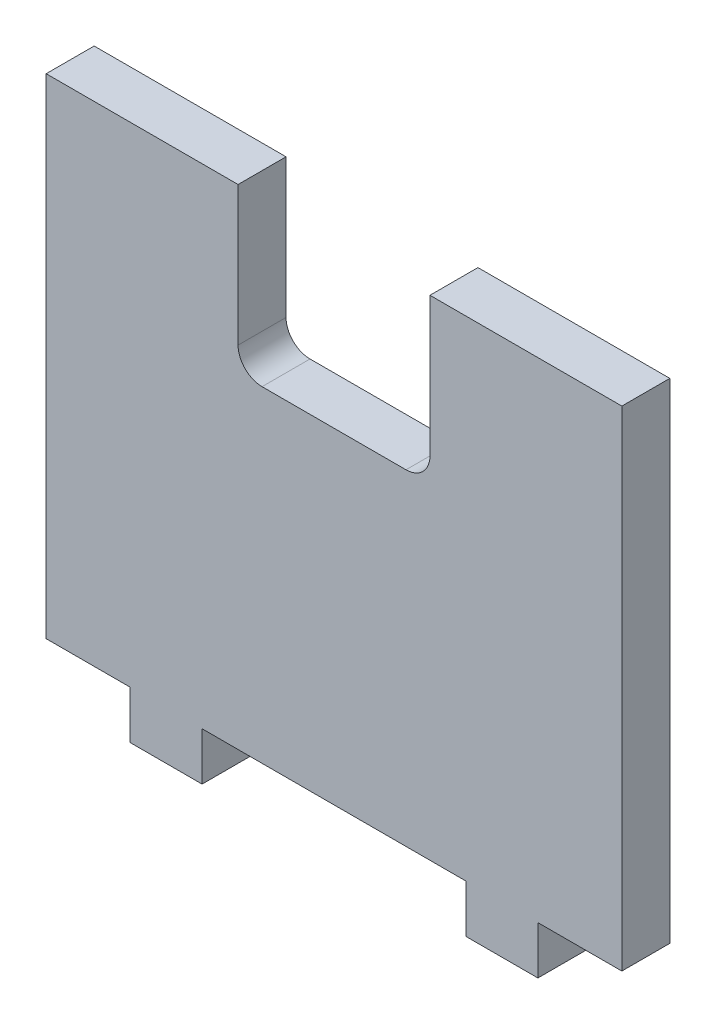
ISO-10303-21;
HEADER;
FILE_DESCRIPTION(('STEP AP214'),'2;1');
FILE_NAME('part.step','',(''),(''),'','','');
FILE_SCHEMA(('AUTOMOTIVE_DESIGN { 1 0 10303 214 1 1 1 1 }'));
ENDSEC;
DATA;
#1=APPLICATION_CONTEXT('core data for automotive mechanical design processes');
#2=APPLICATION_PROTOCOL_DEFINITION('international standard','automotive_design',2000,#1);
#3=PRODUCT_CONTEXT('',#1,'mechanical');
#4=PRODUCT('Part','Part','',(#3));
#5=PRODUCT_RELATED_PRODUCT_CATEGORY('part','',(#4));
#6=PRODUCT_DEFINITION_FORMATION('','',#4);
#7=PRODUCT_DEFINITION_CONTEXT('part definition',#1,'design');
#8=PRODUCT_DEFINITION('design','',#6,#7);
#9=PRODUCT_DEFINITION_SHAPE('','',#8);
#10=(LENGTH_UNIT() NAMED_UNIT(*) SI_UNIT(.MILLI.,.METRE.));
#11=(NAMED_UNIT(*) PLANE_ANGLE_UNIT() SI_UNIT($,.RADIAN.));
#12=(NAMED_UNIT(*) SI_UNIT($,.STERADIAN.) SOLID_ANGLE_UNIT());
#13=UNCERTAINTY_MEASURE_WITH_UNIT(LENGTH_MEASURE(1.E-05),#10,'distance_accuracy_value','');
#14=(GEOMETRIC_REPRESENTATION_CONTEXT(3) GLOBAL_UNCERTAINTY_ASSIGNED_CONTEXT((#13)) GLOBAL_UNIT_ASSIGNED_CONTEXT((#10,
#11,#12)) REPRESENTATION_CONTEXT('',''));
#15=CARTESIAN_POINT('',(0.,0.,0.));
#16=DIRECTION('',(0.,0.,1.));
#17=DIRECTION('',(1.,0.,0.));
#18=AXIS2_PLACEMENT_3D('',#15,#16,#17);
#19=CARTESIAN_POINT('',(-76.2000000000001,142.24,-12.7));
#20=DIRECTION('',(0.,1.,0.));
#21=DIRECTION('',(0.,0.,1.));
#22=AXIS2_PLACEMENT_3D('',#19,#20,#21);
#23=PLANE('',#22);
#24=DIRECTION('',(0.,0.,1.));
#25=VECTOR('',#24,1.);
#26=CARTESIAN_POINT('',(-25.3999999999998,142.24,-12.7));
#27=LINE('',#26,#25);
#28=CARTESIAN_POINT('',(-25.3999999999998,142.24,-12.7));
#29=VERTEX_POINT('',#28);
#30=CARTESIAN_POINT('',(-25.3999999999998,142.24,0.));
#31=VERTEX_POINT('',#30);
#32=EDGE_CURVE('E178',#29,#31,#27,.T.);
#33=ORIENTED_EDGE('',*,*,#32,.F.);
#34=DIRECTION('',(-1.,0.,0.));
#35=VECTOR('',#34,1.);
#36=CARTESIAN_POINT('',(-76.2000000000001,142.24,-12.7));
#37=LINE('',#36,#35);
#38=CARTESIAN_POINT('',(-76.2000000000001,142.24,-12.7));
#39=VERTEX_POINT('',#38);
#40=EDGE_CURVE('E184',#29,#39,#37,.T.);
#41=ORIENTED_EDGE('',*,*,#40,.T.);
#42=DIRECTION('',(0.,0.,1.));
#43=VECTOR('',#42,1.);
#44=CARTESIAN_POINT('',(-76.2000000000001,142.24,-12.7));
#45=LINE('',#44,#43);
#46=CARTESIAN_POINT('',(-76.2000000000001,142.24,0.));
#47=VERTEX_POINT('',#46);
#48=EDGE_CURVE('E229',#39,#47,#45,.T.);
#49=ORIENTED_EDGE('',*,*,#48,.T.);
#50=DIRECTION('',(-1.,0.,0.));
#51=VECTOR('',#50,1.);
#52=CARTESIAN_POINT('',(-76.2000000000001,142.24,0.));
#53=LINE('',#52,#51);
#54=EDGE_CURVE('E225',#31,#47,#53,.T.);
#55=ORIENTED_EDGE('',*,*,#54,.F.);
#56=EDGE_LOOP('',(#33,#41,#49,#55));
#57=FACE_BOUND('',#56,.T.);
#58=ADVANCED_FACE('F31',(#57),#23,.T.);
#59=CARTESIAN_POINT('',(-76.2000000000001,142.24,-12.7));
#60=DIRECTION('',(-1.,0.,0.));
#61=DIRECTION('',(0.,-1.,0.));
#62=AXIS2_PLACEMENT_3D('',#59,#60,#61);
#63=PLANE('',#62);
#64=DIRECTION('',(0.,-1.,0.));
#65=VECTOR('',#64,1.);
#66=CARTESIAN_POINT('',(-76.2000000000001,142.24,0.));
#67=LINE('',#66,#65);
#68=CARTESIAN_POINT('',(-76.2,12.7,0.));
#69=VERTEX_POINT('',#68);
#70=EDGE_CURVE('E192',#47,#69,#67,.T.);
#71=ORIENTED_EDGE('',*,*,#70,.F.);
#72=ORIENTED_EDGE('',*,*,#48,.F.);
#73=DIRECTION('',(0.,-1.,0.));
#74=VECTOR('',#73,1.);
#75=CARTESIAN_POINT('',(-76.2000000000001,142.24,-12.7));
#76=LINE('',#75,#74);
#77=CARTESIAN_POINT('',(-76.2,12.7,-12.7));
#78=VERTEX_POINT('',#77);
#79=EDGE_CURVE('E228',#39,#78,#76,.T.);
#80=ORIENTED_EDGE('',*,*,#79,.T.);
#81=DIRECTION('',(0.,0.,1.));
#82=VECTOR('',#81,1.);
#83=CARTESIAN_POINT('',(-76.2,12.7,-12.7));
#84=LINE('',#83,#82);
#85=EDGE_CURVE('E183',#78,#69,#84,.T.);
#86=ORIENTED_EDGE('',*,*,#85,.T.);
#87=EDGE_LOOP('',(#71,#72,#80,#86));
#88=FACE_BOUND('',#87,.T.);
#89=ADVANCED_FACE('F281',(#88),#63,.T.);
#90=DIRECTION('',(0.,0.,1.));
#91=VECTOR('',#90,1.);
#92=CARTESIAN_POINT('',(25.3999999999998,142.24,-12.7));
#93=LINE('',#92,#91);
#94=CARTESIAN_POINT('',(25.3999999999998,142.24,-12.7));
#95=VERTEX_POINT('',#94);
#96=CARTESIAN_POINT('',(25.3999999999998,142.24,0.));
#97=VERTEX_POINT('',#96);
#98=EDGE_CURVE('E168',#95,#97,#93,.T.);
#99=ORIENTED_EDGE('',*,*,#98,.T.);
#100=CARTESIAN_POINT('',(76.1999999999999,142.24,0.));
#101=VERTEX_POINT('',#100);
#102=EDGE_CURVE('E226',#101,#97,#53,.T.);
#103=ORIENTED_EDGE('',*,*,#102,.F.);
#104=DIRECTION('',(0.,0.,1.));
#105=VECTOR('',#104,1.);
#106=CARTESIAN_POINT('',(76.1999999999999,142.24,-12.7));
#107=LINE('',#106,#105);
#108=CARTESIAN_POINT('',(76.1999999999999,142.24,-12.7));
#109=VERTEX_POINT('',#108);
#110=EDGE_CURVE('E181',#109,#101,#107,.T.);
#111=ORIENTED_EDGE('',*,*,#110,.F.);
#112=EDGE_CURVE('E161',#109,#95,#37,.T.);
#113=ORIENTED_EDGE('',*,*,#112,.T.);
#114=EDGE_LOOP('',(#99,#103,#111,#113));
#115=FACE_BOUND('',#114,.T.);
#116=ADVANCED_FACE('F180',(#115),#23,.T.);
#117=CARTESIAN_POINT('',(76.1999999999999,142.24,-12.7));
#118=DIRECTION('',(1.,0.,0.));
#119=DIRECTION('',(0.,1.,0.));
#120=AXIS2_PLACEMENT_3D('',#117,#118,#119);
#121=PLANE('',#120);
#122=DIRECTION('',(0.,1.,0.));
#123=VECTOR('',#122,1.);
#124=CARTESIAN_POINT('',(76.1999999999999,142.24,0.));
#125=LINE('',#124,#123);
#126=CARTESIAN_POINT('',(76.2,12.7,0.));
#127=VERTEX_POINT('',#126);
#128=EDGE_CURVE('E222',#127,#101,#125,.T.);
#129=ORIENTED_EDGE('',*,*,#128,.F.);
#130=DIRECTION('',(0.,0.,1.));
#131=VECTOR('',#130,1.);
#132=CARTESIAN_POINT('',(76.2,12.7,-12.7));
#133=LINE('',#132,#131);
#134=CARTESIAN_POINT('',(76.2,12.7,-12.7));
#135=VERTEX_POINT('',#134);
#136=EDGE_CURVE('E234',#135,#127,#133,.T.);
#137=ORIENTED_EDGE('',*,*,#136,.F.);
#138=DIRECTION('',(0.,1.,0.));
#139=VECTOR('',#138,1.);
#140=CARTESIAN_POINT('',(76.1999999999999,142.24,-12.7));
#141=LINE('',#140,#139);
#142=EDGE_CURVE('E188',#135,#109,#141,.T.);
#143=ORIENTED_EDGE('',*,*,#142,.T.);
#144=ORIENTED_EDGE('',*,*,#110,.T.);
#145=EDGE_LOOP('',(#129,#137,#143,#144));
#146=FACE_BOUND('',#145,.T.);
#147=ADVANCED_FACE('F292',(#146),#121,.T.);
#148=CARTESIAN_POINT('',(53.975,12.7,-12.7));
#149=DIRECTION('',(0.,-1.,0.));
#150=DIRECTION('',(0.,0.,-1.));
#151=AXIS2_PLACEMENT_3D('',#148,#149,#150);
#152=PLANE('',#151);
#153=DIRECTION('',(1.,0.,0.));
#154=VECTOR('',#153,1.);
#155=CARTESIAN_POINT('',(53.975,12.7,0.));
#156=LINE('',#155,#154);
#157=CARTESIAN_POINT('',(53.975,12.7,0.));
#158=VERTEX_POINT('',#157);
#159=EDGE_CURVE('E219',#158,#127,#156,.T.);
#160=ORIENTED_EDGE('',*,*,#159,.F.);
#161=DIRECTION('',(0.,0.,1.));
#162=VECTOR('',#161,1.);
#163=CARTESIAN_POINT('',(53.975,12.7,-12.7));
#164=LINE('',#163,#162);
#165=CARTESIAN_POINT('',(53.975,12.7,-12.7));
#166=VERTEX_POINT('',#165);
#167=EDGE_CURVE('E236',#166,#158,#164,.T.);
#168=ORIENTED_EDGE('',*,*,#167,.F.);
#169=DIRECTION('',(1.,0.,0.));
#170=VECTOR('',#169,1.);
#171=CARTESIAN_POINT('',(53.975,12.7,-12.7));
#172=LINE('',#171,#170);
#173=EDGE_CURVE('E374',#166,#135,#172,.T.);
#174=ORIENTED_EDGE('',*,*,#173,.T.);
#175=ORIENTED_EDGE('',*,*,#136,.T.);
#176=EDGE_LOOP('',(#160,#168,#174,#175));
#177=FACE_BOUND('',#176,.T.);
#178=ADVANCED_FACE('F296',(#177),#152,.T.);
#179=CARTESIAN_POINT('',(53.975,0.,-12.7));
#180=DIRECTION('',(1.,0.,0.));
#181=DIRECTION('',(0.,0.,-1.));
#182=AXIS2_PLACEMENT_3D('',#179,#180,#181);
#183=PLANE('',#182);
#184=DIRECTION('',(0.,1.,0.));
#185=VECTOR('',#184,1.);
#186=CARTESIAN_POINT('',(53.975,0.,0.));
#187=LINE('',#186,#185);
#188=CARTESIAN_POINT('',(53.975,0.,0.));
#189=VERTEX_POINT('',#188);
#190=EDGE_CURVE('E216',#189,#158,#187,.T.);
#191=ORIENTED_EDGE('',*,*,#190,.F.);
#192=DIRECTION('',(0.,0.,1.));
#193=VECTOR('',#192,1.);
#194=CARTESIAN_POINT('',(53.975,0.,-12.7));
#195=LINE('',#194,#193);
#196=CARTESIAN_POINT('',(53.975,0.,-12.7));
#197=VERTEX_POINT('',#196);
#198=EDGE_CURVE('E238',#197,#189,#195,.T.);
#199=ORIENTED_EDGE('',*,*,#198,.F.);
#200=DIRECTION('',(0.,1.,0.));
#201=VECTOR('',#200,1.);
#202=CARTESIAN_POINT('',(53.975,0.,-12.7));
#203=LINE('',#202,#201);
#204=EDGE_CURVE('E372',#197,#166,#203,.T.);
#205=ORIENTED_EDGE('',*,*,#204,.T.);
#206=ORIENTED_EDGE('',*,*,#167,.T.);
#207=EDGE_LOOP('',(#191,#199,#205,#206));
#208=FACE_BOUND('',#207,.T.);
#209=ADVANCED_FACE('F301',(#208),#183,.T.);
#210=CARTESIAN_POINT('',(53.975,0.,-12.7));
#211=DIRECTION('',(0.,-1.,0.));
#212=DIRECTION('',(0.,0.,-1.));
#213=AXIS2_PLACEMENT_3D('',#210,#211,#212);
#214=PLANE('',#213);
#215=DIRECTION('',(1.,0.,0.));
#216=VECTOR('',#215,1.);
#217=CARTESIAN_POINT('',(53.975,0.,0.));
#218=LINE('',#217,#216);
#219=CARTESIAN_POINT('',(34.9249999999999,0.,0.));
#220=VERTEX_POINT('',#219);
#221=EDGE_CURVE('E213',#220,#189,#218,.T.);
#222=ORIENTED_EDGE('',*,*,#221,.F.);
#223=DIRECTION('',(0.,0.,1.));
#224=VECTOR('',#223,1.);
#225=CARTESIAN_POINT('',(34.9249999999999,0.,-12.7));
#226=LINE('',#225,#224);
#227=CARTESIAN_POINT('',(34.9249999999999,0.,-12.7));
#228=VERTEX_POINT('',#227);
#229=EDGE_CURVE('E240',#228,#220,#226,.T.);
#230=ORIENTED_EDGE('',*,*,#229,.F.);
#231=DIRECTION('',(1.,0.,0.));
#232=VECTOR('',#231,1.);
#233=CARTESIAN_POINT('',(53.975,0.,-12.7));
#234=LINE('',#233,#232);
#235=EDGE_CURVE('E369',#228,#197,#234,.T.);
#236=ORIENTED_EDGE('',*,*,#235,.T.);
#237=ORIENTED_EDGE('',*,*,#198,.T.);
#238=EDGE_LOOP('',(#222,#230,#236,#237));
#239=FACE_BOUND('',#238,.T.);
#240=ADVANCED_FACE('F308',(#239),#214,.T.);
#241=CARTESIAN_POINT('',(34.9249999999999,0.,-12.7));
#242=DIRECTION('',(-1.,0.,0.));
#243=DIRECTION('',(0.,0.,1.));
#244=AXIS2_PLACEMENT_3D('',#241,#242,#243);
#245=PLANE('',#244);
#246=DIRECTION('',(0.,-1.,0.));
#247=VECTOR('',#246,1.);
#248=CARTESIAN_POINT('',(34.9249999999999,0.,0.));
#249=LINE('',#248,#247);
#250=CARTESIAN_POINT('',(34.9249999999999,12.7,0.));
#251=VERTEX_POINT('',#250);
#252=EDGE_CURVE('E210',#251,#220,#249,.T.);
#253=ORIENTED_EDGE('',*,*,#252,.F.);
#254=DIRECTION('',(0.,0.,1.));
#255=VECTOR('',#254,1.);
#256=CARTESIAN_POINT('',(34.9249999999999,12.7,-12.7));
#257=LINE('',#256,#255);
#258=CARTESIAN_POINT('',(34.9249999999999,12.7,-12.7));
#259=VERTEX_POINT('',#258);
#260=EDGE_CURVE('E242',#259,#251,#257,.T.);
#261=ORIENTED_EDGE('',*,*,#260,.F.);
#262=DIRECTION('',(0.,-1.,0.));
#263=VECTOR('',#262,1.);
#264=CARTESIAN_POINT('',(34.9249999999999,0.,-12.7));
#265=LINE('',#264,#263);
#266=EDGE_CURVE('E366',#259,#228,#265,.T.);
#267=ORIENTED_EDGE('',*,*,#266,.T.);
#268=ORIENTED_EDGE('',*,*,#229,.T.);
#269=EDGE_LOOP('',(#253,#261,#267,#268));
#270=FACE_BOUND('',#269,.T.);
#271=ADVANCED_FACE('F312',(#270),#245,.T.);
#272=CARTESIAN_POINT('',(-34.9250000000001,12.7,-12.7));
#273=DIRECTION('',(0.,-1.,0.));
#274=DIRECTION('',(0.,0.,-1.));
#275=AXIS2_PLACEMENT_3D('',#272,#273,#274);
#276=PLANE('',#275);
#277=DIRECTION('',(1.,0.,0.));
#278=VECTOR('',#277,1.);
#279=CARTESIAN_POINT('',(-34.9250000000001,12.7,0.));
#280=LINE('',#279,#278);
#281=CARTESIAN_POINT('',(-34.9250000000001,12.7,0.));
#282=VERTEX_POINT('',#281);
#283=EDGE_CURVE('E207',#282,#251,#280,.T.);
#284=ORIENTED_EDGE('',*,*,#283,.F.);
#285=DIRECTION('',(0.,0.,1.));
#286=VECTOR('',#285,1.);
#287=CARTESIAN_POINT('',(-34.9250000000001,12.7,-12.7));
#288=LINE('',#287,#286);
#289=CARTESIAN_POINT('',(-34.9250000000001,12.7,-12.7));
#290=VERTEX_POINT('',#289);
#291=EDGE_CURVE('E244',#290,#282,#288,.T.);
#292=ORIENTED_EDGE('',*,*,#291,.F.);
#293=DIRECTION('',(1.,0.,0.));
#294=VECTOR('',#293,1.);
#295=CARTESIAN_POINT('',(-34.9250000000001,12.7,-12.7));
#296=LINE('',#295,#294);
#297=EDGE_CURVE('E363',#290,#259,#296,.T.);
#298=ORIENTED_EDGE('',*,*,#297,.T.);
#299=ORIENTED_EDGE('',*,*,#260,.T.);
#300=EDGE_LOOP('',(#284,#292,#298,#299));
#301=FACE_BOUND('',#300,.T.);
#302=ADVANCED_FACE('F316',(#301),#276,.T.);
#303=CARTESIAN_POINT('',(-34.9250000000001,0.,-12.7));
#304=DIRECTION('',(1.,0.,0.));
#305=DIRECTION('',(0.,0.,-1.));
#306=AXIS2_PLACEMENT_3D('',#303,#304,#305);
#307=PLANE('',#306);
#308=DIRECTION('',(0.,1.,0.));
#309=VECTOR('',#308,1.);
#310=CARTESIAN_POINT('',(-34.9250000000001,0.,0.));
#311=LINE('',#310,#309);
#312=CARTESIAN_POINT('',(-34.9250000000001,0.,0.));
#313=VERTEX_POINT('',#312);
#314=EDGE_CURVE('E204',#313,#282,#311,.T.);
#315=ORIENTED_EDGE('',*,*,#314,.F.);
#316=DIRECTION('',(0.,0.,1.));
#317=VECTOR('',#316,1.);
#318=CARTESIAN_POINT('',(-34.9250000000001,0.,-12.7));
#319=LINE('',#318,#317);
#320=CARTESIAN_POINT('',(-34.9250000000001,0.,-12.7));
#321=VERTEX_POINT('',#320);
#322=EDGE_CURVE('E246',#321,#313,#319,.T.);
#323=ORIENTED_EDGE('',*,*,#322,.F.);
#324=DIRECTION('',(0.,1.,0.));
#325=VECTOR('',#324,1.);
#326=CARTESIAN_POINT('',(-34.9250000000001,0.,-12.7));
#327=LINE('',#326,#325);
#328=EDGE_CURVE('E360',#321,#290,#327,.T.);
#329=ORIENTED_EDGE('',*,*,#328,.T.);
#330=ORIENTED_EDGE('',*,*,#291,.T.);
#331=EDGE_LOOP('',(#315,#323,#329,#330));
#332=FACE_BOUND('',#331,.T.);
#333=ADVANCED_FACE('F320',(#332),#307,.T.);
#334=CARTESIAN_POINT('',(-34.9250000000001,0.,-12.7));
#335=DIRECTION('',(0.,-1.,0.));
#336=DIRECTION('',(0.,0.,-1.));
#337=AXIS2_PLACEMENT_3D('',#334,#335,#336);
#338=PLANE('',#337);
#339=DIRECTION('',(1.,0.,0.));
#340=VECTOR('',#339,1.);
#341=CARTESIAN_POINT('',(-34.9250000000001,0.,0.));
#342=LINE('',#341,#340);
#343=CARTESIAN_POINT('',(-53.9750000000001,0.,0.));
#344=VERTEX_POINT('',#343);
#345=EDGE_CURVE('E201',#344,#313,#342,.T.);
#346=ORIENTED_EDGE('',*,*,#345,.F.);
#347=DIRECTION('',(0.,0.,1.));
#348=VECTOR('',#347,1.);
#349=CARTESIAN_POINT('',(-53.9750000000001,0.,-12.7));
#350=LINE('',#349,#348);
#351=CARTESIAN_POINT('',(-53.9750000000001,0.,-12.7));
#352=VERTEX_POINT('',#351);
#353=EDGE_CURVE('E248',#352,#344,#350,.T.);
#354=ORIENTED_EDGE('',*,*,#353,.F.);
#355=DIRECTION('',(1.,0.,0.));
#356=VECTOR('',#355,1.);
#357=CARTESIAN_POINT('',(-34.9250000000001,0.,-12.7));
#358=LINE('',#357,#356);
#359=EDGE_CURVE('E357',#352,#321,#358,.T.);
#360=ORIENTED_EDGE('',*,*,#359,.T.);
#361=ORIENTED_EDGE('',*,*,#322,.T.);
#362=EDGE_LOOP('',(#346,#354,#360,#361));
#363=FACE_BOUND('',#362,.T.);
#364=ADVANCED_FACE('F324',(#363),#338,.T.);
#365=CARTESIAN_POINT('',(-53.9750000000001,0.,-12.7));
#366=DIRECTION('',(-1.,0.,0.));
#367=DIRECTION('',(0.,0.,1.));
#368=AXIS2_PLACEMENT_3D('',#365,#366,#367);
#369=PLANE('',#368);
#370=DIRECTION('',(0.,-1.,0.));
#371=VECTOR('',#370,1.);
#372=CARTESIAN_POINT('',(-53.9750000000001,0.,0.));
#373=LINE('',#372,#371);
#374=CARTESIAN_POINT('',(-53.9750000000001,12.7,0.));
#375=VERTEX_POINT('',#374);
#376=EDGE_CURVE('E198',#375,#344,#373,.T.);
#377=ORIENTED_EDGE('',*,*,#376,.F.);
#378=DIRECTION('',(0.,0.,1.));
#379=VECTOR('',#378,1.);
#380=CARTESIAN_POINT('',(-53.9750000000001,12.7,-12.7));
#381=LINE('',#380,#379);
#382=CARTESIAN_POINT('',(-53.9750000000001,12.7,-12.7));
#383=VERTEX_POINT('',#382);
#384=EDGE_CURVE('E186',#383,#375,#381,.T.);
#385=ORIENTED_EDGE('',*,*,#384,.F.);
#386=DIRECTION('',(0.,-1.,0.));
#387=VECTOR('',#386,1.);
#388=CARTESIAN_POINT('',(-53.9750000000001,0.,-12.7));
#389=LINE('',#388,#387);
#390=EDGE_CURVE('E351',#383,#352,#389,.T.);
#391=ORIENTED_EDGE('',*,*,#390,.T.);
#392=ORIENTED_EDGE('',*,*,#353,.T.);
#393=EDGE_LOOP('',(#377,#385,#391,#392));
#394=FACE_BOUND('',#393,.T.);
#395=ADVANCED_FACE('F328',(#394),#369,.T.);
#396=CARTESIAN_POINT('',(-76.2,12.7,-12.7));
#397=DIRECTION('',(0.,-1.,0.));
#398=DIRECTION('',(0.,0.,-1.));
#399=AXIS2_PLACEMENT_3D('',#396,#397,#398);
#400=PLANE('',#399);
#401=DIRECTION('',(1.,0.,0.));
#402=VECTOR('',#401,1.);
#403=CARTESIAN_POINT('',(-76.2,12.7,0.));
#404=LINE('',#403,#402);
#405=EDGE_CURVE('E195',#69,#375,#404,.T.);
#406=ORIENTED_EDGE('',*,*,#405,.F.);
#407=ORIENTED_EDGE('',*,*,#85,.F.);
#408=DIRECTION('',(1.,0.,0.));
#409=VECTOR('',#408,1.);
#410=CARTESIAN_POINT('',(-76.2,12.7,-12.7));
#411=LINE('',#410,#409);
#412=EDGE_CURVE('E349',#78,#383,#411,.T.);
#413=ORIENTED_EDGE('',*,*,#412,.T.);
#414=ORIENTED_EDGE('',*,*,#384,.T.);
#415=EDGE_LOOP('',(#406,#407,#413,#414));
#416=FACE_BOUND('',#415,.T.);
#417=ADVANCED_FACE('F332',(#416),#400,.T.);
#418=CARTESIAN_POINT('',(-76.2,12.7,-12.7));
#419=DIRECTION('',(0.,0.,1.));
#420=DIRECTION('',(1.,0.,0.));
#421=AXIS2_PLACEMENT_3D('',#418,#419,#420);
#422=PLANE('',#421);
#423=ORIENTED_EDGE('',*,*,#40,.F.);
#424=DIRECTION('',(0.,-1.,0.));
#425=VECTOR('',#424,1.);
#426=CARTESIAN_POINT('',(-25.3999999999998,142.24,-12.7));
#427=LINE('',#426,#425);
#428=CARTESIAN_POINT('',(-25.3999999999998,105.41,-12.7));
#429=VERTEX_POINT('',#428);
#430=EDGE_CURVE('E392',#29,#429,#427,.T.);
#431=ORIENTED_EDGE('',*,*,#430,.T.);
#432=CARTESIAN_POINT('',(-19.0499999999998,105.41,-12.7));
#433=DIRECTION('',(0.,0.,1.));
#434=DIRECTION('',(1.,0.,0.));
#435=AXIS2_PLACEMENT_3D('',#432,#433,#434);
#436=CIRCLE('',#435,6.35);
#437=CARTESIAN_POINT('',(-19.0499999999998,99.06,-12.7));
#438=VERTEX_POINT('',#437);
#439=EDGE_CURVE('E11',#429,#438,#436,.T.);
#440=ORIENTED_EDGE('',*,*,#439,.T.);
#441=DIRECTION('',(1.,0.,0.));
#442=VECTOR('',#441,1.);
#443=CARTESIAN_POINT('',(-25.3999999999998,99.06,-12.7));
#444=LINE('',#443,#442);
#445=CARTESIAN_POINT('',(19.0500000000001,99.06,-12.7));
#446=VERTEX_POINT('',#445);
#447=EDGE_CURVE('E169',#438,#446,#444,.T.);
#448=ORIENTED_EDGE('',*,*,#447,.T.);
#449=CARTESIAN_POINT('',(19.0500000000001,105.41,-12.7));
#450=DIRECTION('',(0.,0.,1.));
#451=DIRECTION('',(1.,0.,0.));
#452=AXIS2_PLACEMENT_3D('',#449,#450,#451);
#453=CIRCLE('',#452,6.35);
#454=CARTESIAN_POINT('',(25.4000000000001,105.41,-12.7));
#455=VERTEX_POINT('',#454);
#456=EDGE_CURVE('E164',#446,#455,#453,.T.);
#457=ORIENTED_EDGE('',*,*,#456,.T.);
#458=DIRECTION('',(0.,1.,0.));
#459=VECTOR('',#458,1.);
#460=CARTESIAN_POINT('',(25.3999999999998,142.24,-12.7));
#461=LINE('',#460,#459);
#462=EDGE_CURVE('E155',#455,#95,#461,.T.);
#463=ORIENTED_EDGE('',*,*,#462,.T.);
#464=ORIENTED_EDGE('',*,*,#112,.F.);
#465=ORIENTED_EDGE('',*,*,#142,.F.);
#466=ORIENTED_EDGE('',*,*,#173,.F.);
#467=ORIENTED_EDGE('',*,*,#204,.F.);
#468=ORIENTED_EDGE('',*,*,#235,.F.);
#469=ORIENTED_EDGE('',*,*,#266,.F.);
#470=ORIENTED_EDGE('',*,*,#297,.F.);
#471=ORIENTED_EDGE('',*,*,#328,.F.);
#472=ORIENTED_EDGE('',*,*,#359,.F.);
#473=ORIENTED_EDGE('',*,*,#390,.F.);
#474=ORIENTED_EDGE('',*,*,#412,.F.);
#475=ORIENTED_EDGE('',*,*,#79,.F.);
#476=EDGE_LOOP('',(#423,#431,#440,#448,#457,#463,#464,#465,#466,#467,#468,#469,#470,#471,#472,
#473,#474,#475));
#477=FACE_BOUND('',#476,.T.);
#478=ADVANCED_FACE('F158',(#477),#422,.F.);
#479=CARTESIAN_POINT('',(-76.2,12.7,0.));
#480=DIRECTION('',(0.,0.,1.));
#481=DIRECTION('',(1.,0.,0.));
#482=AXIS2_PLACEMENT_3D('',#479,#480,#481);
#483=PLANE('',#482);
#484=DIRECTION('',(0.,-1.,0.));
#485=VECTOR('',#484,1.);
#486=CARTESIAN_POINT('',(-25.3999999999998,142.24,0.));
#487=LINE('',#486,#485);
#488=CARTESIAN_POINT('',(-25.3999999999998,105.41,0.));
#489=VERTEX_POINT('',#488);
#490=EDGE_CURVE('E269',#31,#489,#487,.T.);
#491=ORIENTED_EDGE('',*,*,#490,.F.);
#492=ORIENTED_EDGE('',*,*,#54,.T.);
#493=ORIENTED_EDGE('',*,*,#70,.T.);
#494=ORIENTED_EDGE('',*,*,#405,.T.);
#495=ORIENTED_EDGE('',*,*,#376,.T.);
#496=ORIENTED_EDGE('',*,*,#345,.T.);
#497=ORIENTED_EDGE('',*,*,#314,.T.);
#498=ORIENTED_EDGE('',*,*,#283,.T.);
#499=ORIENTED_EDGE('',*,*,#252,.T.);
#500=ORIENTED_EDGE('',*,*,#221,.T.);
#501=ORIENTED_EDGE('',*,*,#190,.T.);
#502=ORIENTED_EDGE('',*,*,#159,.T.);
#503=ORIENTED_EDGE('',*,*,#128,.T.);
#504=ORIENTED_EDGE('',*,*,#102,.T.);
#505=DIRECTION('',(0.,1.,0.));
#506=VECTOR('',#505,1.);
#507=CARTESIAN_POINT('',(25.3999999999998,142.24,0.));
#508=LINE('',#507,#506);
#509=CARTESIAN_POINT('',(25.4000000000001,105.41,0.));
#510=VERTEX_POINT('',#509);
#511=EDGE_CURVE('E174',#510,#97,#508,.T.);
#512=ORIENTED_EDGE('',*,*,#511,.F.);
#513=CARTESIAN_POINT('',(19.0500000000001,105.41,0.));
#514=DIRECTION('',(0.,0.,1.));
#515=DIRECTION('',(1.,0.,0.));
#516=AXIS2_PLACEMENT_3D('',#513,#514,#515);
#517=CIRCLE('',#516,6.35);
#518=CARTESIAN_POINT('',(19.0500000000001,99.06,0.));
#519=VERTEX_POINT('',#518);
#520=EDGE_CURVE('E258',#510,#519,#517,.F.);
#521=ORIENTED_EDGE('',*,*,#520,.T.);
#522=DIRECTION('',(1.,0.,0.));
#523=VECTOR('',#522,1.);
#524=CARTESIAN_POINT('',(-25.3999999999998,99.06,0.));
#525=LINE('',#524,#523);
#526=CARTESIAN_POINT('',(-19.0499999999998,99.06,0.));
#527=VERTEX_POINT('',#526);
#528=EDGE_CURVE('E262',#527,#519,#525,.T.);
#529=ORIENTED_EDGE('',*,*,#528,.F.);
#530=CARTESIAN_POINT('',(-19.0499999999998,105.41,0.));
#531=DIRECTION('',(0.,0.,1.));
#532=DIRECTION('',(1.,0.,0.));
#533=AXIS2_PLACEMENT_3D('',#530,#531,#532);
#534=CIRCLE('',#533,6.35);
#535=EDGE_CURVE('E39',#527,#489,#534,.F.);
#536=ORIENTED_EDGE('',*,*,#535,.T.);
#537=EDGE_LOOP('',(#491,#492,#493,#494,#495,#496,#497,#498,#499,#500,#501,#502,#503,#504,#512,
#521,#529,#536));
#538=FACE_BOUND('',#537,.T.);
#539=ADVANCED_FACE('F261',(#538),#483,.T.);
#540=CARTESIAN_POINT('',(-25.3999999999998,142.24,-12.7));
#541=DIRECTION('',(-1.,0.,0.));
#542=DIRECTION('',(0.,-1.,0.));
#543=AXIS2_PLACEMENT_3D('',#540,#541,#542);
#544=PLANE('',#543);
#545=ORIENTED_EDGE('',*,*,#490,.T.);
#546=DIRECTION('',(0.,0.,1.));
#547=VECTOR('',#546,1.);
#548=CARTESIAN_POINT('',(-25.3999999999998,105.41,-12.7));
#549=LINE('',#548,#547);
#550=EDGE_CURVE('E46',#489,#429,#549,.F.);
#551=ORIENTED_EDGE('',*,*,#550,.T.);
#552=ORIENTED_EDGE('',*,*,#430,.F.);
#553=ORIENTED_EDGE('',*,*,#32,.T.);
#554=EDGE_LOOP('',(#545,#551,#552,#553));
#555=FACE_BOUND('',#554,.T.);
#556=ADVANCED_FACE('F397',(#555),#544,.F.);
#557=CARTESIAN_POINT('',(25.3999999999998,142.24,-12.7));
#558=DIRECTION('',(1.,0.,0.));
#559=DIRECTION('',(0.,1.,0.));
#560=AXIS2_PLACEMENT_3D('',#557,#558,#559);
#561=PLANE('',#560);
#562=ORIENTED_EDGE('',*,*,#462,.F.);
#563=DIRECTION('',(0.,0.,1.));
#564=VECTOR('',#563,1.);
#565=CARTESIAN_POINT('',(25.4000000000001,105.41,0.));
#566=LINE('',#565,#564);
#567=EDGE_CURVE('E232',#455,#510,#566,.T.);
#568=ORIENTED_EDGE('',*,*,#567,.T.);
#569=ORIENTED_EDGE('',*,*,#511,.T.);
#570=ORIENTED_EDGE('',*,*,#98,.F.);
#571=EDGE_LOOP('',(#562,#568,#569,#570));
#572=FACE_BOUND('',#571,.T.);
#573=ADVANCED_FACE('F172',(#572),#561,.F.);
#574=CARTESIAN_POINT('',(-25.3999999999998,99.06,-12.7));
#575=DIRECTION('',(0.,-1.,0.));
#576=DIRECTION('',(0.,0.,-1.));
#577=AXIS2_PLACEMENT_3D('',#574,#575,#576);
#578=PLANE('',#577);
#579=ORIENTED_EDGE('',*,*,#528,.T.);
#580=DIRECTION('',(0.,0.,1.));
#581=VECTOR('',#580,1.);
#582=CARTESIAN_POINT('',(19.0500000000001,99.06,-12.7));
#583=LINE('',#582,#581);
#584=EDGE_CURVE('E255',#519,#446,#583,.F.);
#585=ORIENTED_EDGE('',*,*,#584,.T.);
#586=ORIENTED_EDGE('',*,*,#447,.F.);
#587=DIRECTION('',(0.,0.,1.));
#588=VECTOR('',#587,1.);
#589=CARTESIAN_POINT('',(-19.0499999999998,99.06,0.));
#590=LINE('',#589,#588);
#591=EDGE_CURVE('E252',#438,#527,#590,.T.);
#592=ORIENTED_EDGE('',*,*,#591,.T.);
#593=EDGE_LOOP('',(#579,#585,#586,#592));
#594=FACE_BOUND('',#593,.T.);
#595=ADVANCED_FACE('F266',(#594),#578,.F.);
#596=CARTESIAN_POINT('',(19.0500000000001,105.41,-12.7));
#597=DIRECTION('',(0.,0.,-1.));
#598=DIRECTION('',(-1.,0.,0.));
#599=AXIS2_PLACEMENT_3D('',#596,#597,#598);
#600=CYLINDRICAL_SURFACE('',#599,6.35);
#601=ORIENTED_EDGE('',*,*,#456,.F.);
#602=ORIENTED_EDGE('',*,*,#584,.F.);
#603=ORIENTED_EDGE('',*,*,#520,.F.);
#604=ORIENTED_EDGE('',*,*,#567,.F.);
#605=EDGE_LOOP('',(#601,#602,#603,#604));
#606=FACE_BOUND('',#605,.T.);
#607=ADVANCED_FACE('F271',(#606),#600,.F.);
#608=CARTESIAN_POINT('',(-19.0499999999998,105.41,-12.7));
#609=DIRECTION('',(0.,0.,-1.));
#610=DIRECTION('',(-1.,0.,0.));
#611=AXIS2_PLACEMENT_3D('',#608,#609,#610);
#612=CYLINDRICAL_SURFACE('',#611,6.35);
#613=ORIENTED_EDGE('',*,*,#439,.F.);
#614=ORIENTED_EDGE('',*,*,#550,.F.);
#615=ORIENTED_EDGE('',*,*,#535,.F.);
#616=ORIENTED_EDGE('',*,*,#591,.F.);
#617=EDGE_LOOP('',(#613,#614,#615,#616));
#618=FACE_BOUND('',#617,.T.);
#619=ADVANCED_FACE('F33',(#618),#612,.F.);
#620=CLOSED_SHELL('',(#58,#89,#116,#147,#178,#209,#240,#271,#302,#333,#364,#395,#417,#478,#539,
#556,#573,#595,#607,#619));
#621=MANIFOLD_SOLID_BREP('B2',#620);
#622=ADVANCED_BREP_SHAPE_REPRESENTATION('',(#18,#621),#14);
#623=SHAPE_DEFINITION_REPRESENTATION(#9,#622);
ENDSEC;
END-ISO-10303-21;
